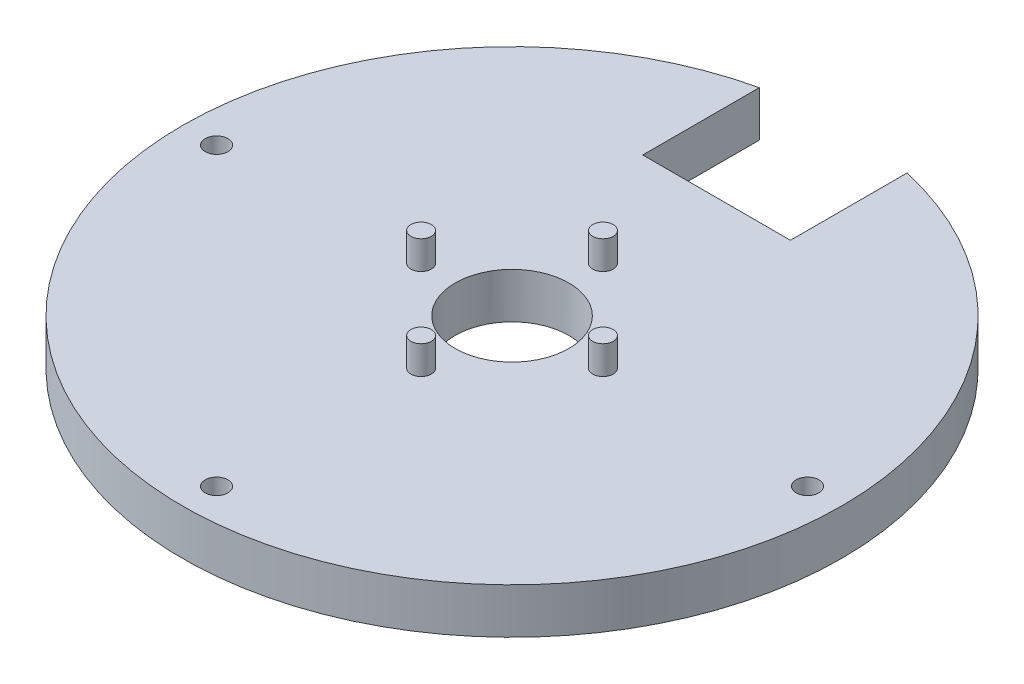
ISO-10303-21;
HEADER;
FILE_DESCRIPTION(('STEP AP214'),'2;1');
FILE_NAME('part.step','',(''),(''),'','','');
FILE_SCHEMA(('AUTOMOTIVE_DESIGN { 1 0 10303 214 1 1 1 1 }'));
ENDSEC;
DATA;
#1=APPLICATION_CONTEXT('core data for automotive mechanical design processes');
#2=APPLICATION_PROTOCOL_DEFINITION('international standard','automotive_design',2000,#1);
#3=PRODUCT_CONTEXT('',#1,'mechanical');
#4=PRODUCT('Part','Part','',(#3));
#5=PRODUCT_RELATED_PRODUCT_CATEGORY('part','',(#4));
#6=PRODUCT_DEFINITION_FORMATION('','',#4);
#7=PRODUCT_DEFINITION_CONTEXT('part definition',#1,'design');
#8=PRODUCT_DEFINITION('design','',#6,#7);
#9=PRODUCT_DEFINITION_SHAPE('','',#8);
#10=(LENGTH_UNIT() NAMED_UNIT(*) SI_UNIT(.MILLI.,.METRE.));
#11=(NAMED_UNIT(*) PLANE_ANGLE_UNIT() SI_UNIT($,.RADIAN.));
#12=(NAMED_UNIT(*) SI_UNIT($,.STERADIAN.) SOLID_ANGLE_UNIT());
#13=UNCERTAINTY_MEASURE_WITH_UNIT(LENGTH_MEASURE(1.E-05),#10,'distance_accuracy_value','');
#14=(GEOMETRIC_REPRESENTATION_CONTEXT(3) GLOBAL_UNCERTAINTY_ASSIGNED_CONTEXT((#13)) GLOBAL_UNIT_ASSIGNED_CONTEXT((#10,
#11,#12)) REPRESENTATION_CONTEXT('',''));
#15=CARTESIAN_POINT('',(0.,0.,0.));
#16=DIRECTION('',(0.,0.,1.));
#17=DIRECTION('',(1.,0.,0.));
#18=AXIS2_PLACEMENT_3D('',#15,#16,#17);
#19=CARTESIAN_POINT('',(0.,5.,0.));
#20=DIRECTION('',(0.,-1.,0.));
#21=DIRECTION('',(0.,0.,-1.));
#22=AXIS2_PLACEMENT_3D('',#19,#20,#21);
#23=CYLINDRICAL_SURFACE('',#22,29.);
#24=CARTESIAN_POINT('',(0.,1.,0.));
#25=DIRECTION('',(0.,-1.,0.));
#26=DIRECTION('',(0.,0.,-1.));
#27=AXIS2_PLACEMENT_3D('',#24,#25,#26);
#28=CIRCLE('',#27,29.);
#29=CARTESIAN_POINT('',(6.5,1.,-28.2621655221252));
#30=VERTEX_POINT('',#29);
#31=CARTESIAN_POINT('',(-6.5,1.,-28.2621655221252));
#32=VERTEX_POINT('',#31);
#33=EDGE_CURVE('E48',#30,#32,#28,.T.);
#34=ORIENTED_EDGE('',*,*,#33,.F.);
#35=DIRECTION('',(0.,-1.,0.));
#36=VECTOR('',#35,1.);
#37=CARTESIAN_POINT('',(6.5,5.,-28.2621655221252));
#38=LINE('',#37,#36);
#39=CARTESIAN_POINT('',(6.5,5.,-28.2621655221252));
#40=VERTEX_POINT('',#39);
#41=EDGE_CURVE('E41',#30,#40,#38,.F.);
#42=ORIENTED_EDGE('',*,*,#41,.T.);
#43=CARTESIAN_POINT('',(0.,5.,0.));
#44=DIRECTION('',(0.,1.,0.));
#45=DIRECTION('',(0.,0.,1.));
#46=AXIS2_PLACEMENT_3D('',#43,#44,#45);
#47=CIRCLE('',#46,29.);
#48=CARTESIAN_POINT('',(-6.5,5.,-28.2621655221252));
#49=VERTEX_POINT('',#48);
#50=EDGE_CURVE('E11',#49,#40,#47,.T.);
#51=ORIENTED_EDGE('',*,*,#50,.F.);
#52=DIRECTION('',(0.,-1.,0.));
#53=VECTOR('',#52,1.);
#54=CARTESIAN_POINT('',(-6.5,5.,-28.2621655221252));
#55=LINE('',#54,#53);
#56=EDGE_CURVE('E81',#49,#32,#55,.T.);
#57=ORIENTED_EDGE('',*,*,#56,.T.);
#58=EDGE_LOOP('',(#34,#42,#51,#57));
#59=FACE_BOUND('',#58,.T.);
#60=ADVANCED_FACE('F33',(#59),#23,.T.);
#61=CARTESIAN_POINT('',(6.5,-5.,-29.));
#62=DIRECTION('',(1.,0.,0.));
#63=DIRECTION('',(0.,0.,-1.));
#64=AXIS2_PLACEMENT_3D('',#61,#62,#63);
#65=PLANE('',#64);
#66=DIRECTION('',(0.,0.,-1.));
#67=VECTOR('',#66,1.);
#68=CARTESIAN_POINT('',(6.5,1.,-29.));
#69=LINE('',#68,#67);
#70=CARTESIAN_POINT('',(6.5,1.,-18.));
#71=VERTEX_POINT('',#70);
#72=EDGE_CURVE('E72',#71,#30,#69,.T.);
#73=ORIENTED_EDGE('',*,*,#72,.F.);
#74=DIRECTION('',(0.,1.,0.));
#75=VECTOR('',#74,1.);
#76=CARTESIAN_POINT('',(6.5,-5.,-18.));
#77=LINE('',#76,#75);
#78=CARTESIAN_POINT('',(6.5,5.,-18.));
#79=VERTEX_POINT('',#78);
#80=EDGE_CURVE('E87',#71,#79,#77,.T.);
#81=ORIENTED_EDGE('',*,*,#80,.T.);
#82=DIRECTION('',(0.,0.,-1.));
#83=VECTOR('',#82,1.);
#84=CARTESIAN_POINT('',(6.5,5.,-29.));
#85=LINE('',#84,#83);
#86=EDGE_CURVE('E85',#79,#40,#85,.T.);
#87=ORIENTED_EDGE('',*,*,#86,.T.);
#88=ORIENTED_EDGE('',*,*,#41,.F.);
#89=EDGE_LOOP('',(#73,#81,#87,#88));
#90=FACE_BOUND('',#89,.T.);
#91=ADVANCED_FACE('F83',(#90),#65,.F.);
#92=CARTESIAN_POINT('',(-6.5,-5.,-18.));
#93=DIRECTION('',(0.,0.,1.));
#94=DIRECTION('',(1.,0.,0.));
#95=AXIS2_PLACEMENT_3D('',#92,#93,#94);
#96=PLANE('',#95);
#97=DIRECTION('',(1.,0.,0.));
#98=VECTOR('',#97,1.);
#99=CARTESIAN_POINT('',(-6.5,1.,-18.));
#100=LINE('',#99,#98);
#101=CARTESIAN_POINT('',(-6.5,1.,-18.));
#102=VERTEX_POINT('',#101);
#103=EDGE_CURVE('E75',#102,#71,#100,.T.);
#104=ORIENTED_EDGE('',*,*,#103,.F.);
#105=DIRECTION('',(0.,1.,0.));
#106=VECTOR('',#105,1.);
#107=CARTESIAN_POINT('',(-6.5,-5.,-18.));
#108=LINE('',#107,#106);
#109=CARTESIAN_POINT('',(-6.5,5.,-18.));
#110=VERTEX_POINT('',#109);
#111=EDGE_CURVE('E90',#102,#110,#108,.T.);
#112=ORIENTED_EDGE('',*,*,#111,.T.);
#113=DIRECTION('',(1.,0.,0.));
#114=VECTOR('',#113,1.);
#115=CARTESIAN_POINT('',(-6.5,5.,-18.));
#116=LINE('',#115,#114);
#117=EDGE_CURVE('E92',#110,#79,#116,.T.);
#118=ORIENTED_EDGE('',*,*,#117,.T.);
#119=ORIENTED_EDGE('',*,*,#80,.F.);
#120=EDGE_LOOP('',(#104,#112,#118,#119));
#121=FACE_BOUND('',#120,.T.);
#122=ADVANCED_FACE('F172',(#121),#96,.F.);
#123=CARTESIAN_POINT('',(-6.5,-5.,-29.));
#124=DIRECTION('',(-1.,0.,0.));
#125=DIRECTION('',(0.,0.,1.));
#126=AXIS2_PLACEMENT_3D('',#123,#124,#125);
#127=PLANE('',#126);
#128=DIRECTION('',(0.,0.,1.));
#129=VECTOR('',#128,1.);
#130=CARTESIAN_POINT('',(-6.5,1.,-29.));
#131=LINE('',#130,#129);
#132=EDGE_CURVE('E136',#32,#102,#131,.T.);
#133=ORIENTED_EDGE('',*,*,#132,.F.);
#134=ORIENTED_EDGE('',*,*,#56,.F.);
#135=DIRECTION('',(0.,0.,1.));
#136=VECTOR('',#135,1.);
#137=CARTESIAN_POINT('',(-6.5,5.,-29.));
#138=LINE('',#137,#136);
#139=EDGE_CURVE('E96',#49,#110,#138,.T.);
#140=ORIENTED_EDGE('',*,*,#139,.T.);
#141=ORIENTED_EDGE('',*,*,#111,.F.);
#142=EDGE_LOOP('',(#133,#134,#140,#141));
#143=FACE_BOUND('',#142,.T.);
#144=ADVANCED_FACE('F177',(#143),#127,.F.);
#145=CARTESIAN_POINT('',(0.,0.,0.));
#146=DIRECTION('',(0.,1.,0.));
#147=DIRECTION('',(0.,0.,1.));
#148=AXIS2_PLACEMENT_3D('',#145,#146,#147);
#149=CYLINDRICAL_SURFACE('',#148,5.);
#150=CARTESIAN_POINT('',(0.,5.,0.));
#151=DIRECTION('',(0.,1.,0.));
#152=DIRECTION('',(0.,0.,1.));
#153=AXIS2_PLACEMENT_3D('',#150,#151,#152);
#154=CIRCLE('',#153,5.);
#155=CARTESIAN_POINT('',(0.,5.,5.));
#156=VERTEX_POINT('',#155);
#157=EDGE_CURVE('E122',#156,#156,#154,.T.);
#158=ORIENTED_EDGE('',*,*,#157,.T.);
#159=EDGE_LOOP('',(#158));
#160=FACE_BOUND('',#159,.T.);
#161=CARTESIAN_POINT('',(0.,1.,0.));
#162=DIRECTION('',(0.,-1.,0.));
#163=DIRECTION('',(0.,0.,-1.));
#164=AXIS2_PLACEMENT_3D('',#161,#162,#163);
#165=CIRCLE('',#164,5.);
#166=CARTESIAN_POINT('',(0.,1.,-5.));
#167=VERTEX_POINT('',#166);
#168=EDGE_CURVE('E138',#167,#167,#165,.F.);
#169=ORIENTED_EDGE('',*,*,#168,.F.);
#170=EDGE_LOOP('',(#169));
#171=FACE_BOUND('',#170,.T.);
#172=ADVANCED_FACE('F182',(#160,#171),#149,.F.);
#173=CARTESIAN_POINT('',(26.,0.,0.));
#174=DIRECTION('',(0.,1.,0.));
#175=DIRECTION('',(0.,0.,1.));
#176=AXIS2_PLACEMENT_3D('',#173,#174,#175);
#177=CYLINDRICAL_SURFACE('',#176,1.);
#178=CARTESIAN_POINT('',(26.,5.,0.));
#179=DIRECTION('',(0.,1.,0.));
#180=DIRECTION('',(0.,0.,1.));
#181=AXIS2_PLACEMENT_3D('',#178,#179,#180);
#182=CIRCLE('',#181,1.);
#183=CARTESIAN_POINT('',(26.,5.,1.));
#184=VERTEX_POINT('',#183);
#185=EDGE_CURVE('E78',#184,#184,#182,.T.);
#186=ORIENTED_EDGE('',*,*,#185,.T.);
#187=EDGE_LOOP('',(#186));
#188=FACE_BOUND('',#187,.T.);
#189=CARTESIAN_POINT('',(26.,1.,0.));
#190=DIRECTION('',(0.,-1.,0.));
#191=DIRECTION('',(0.,0.,-1.));
#192=AXIS2_PLACEMENT_3D('',#189,#190,#191);
#193=CIRCLE('',#192,1.);
#194=CARTESIAN_POINT('',(26.,1.,-1.));
#195=VERTEX_POINT('',#194);
#196=EDGE_CURVE('E141',#195,#195,#193,.F.);
#197=ORIENTED_EDGE('',*,*,#196,.F.);
#198=EDGE_LOOP('',(#197));
#199=FACE_BOUND('',#198,.T.);
#200=ADVANCED_FACE('F164',(#188,#199),#177,.F.);
#201=CARTESIAN_POINT('',(0.,0.,26.));
#202=DIRECTION('',(0.,1.,0.));
#203=DIRECTION('',(0.,0.,1.));
#204=AXIS2_PLACEMENT_3D('',#201,#202,#203);
#205=CYLINDRICAL_SURFACE('',#204,1.);
#206=CARTESIAN_POINT('',(0.,5.,26.));
#207=DIRECTION('',(0.,1.,0.));
#208=DIRECTION('',(0.,0.,1.));
#209=AXIS2_PLACEMENT_3D('',#206,#207,#208);
#210=CIRCLE('',#209,1.);
#211=CARTESIAN_POINT('',(0.,5.,27.));
#212=VERTEX_POINT('',#211);
#213=EDGE_CURVE('E130',#212,#212,#210,.T.);
#214=ORIENTED_EDGE('',*,*,#213,.T.);
#215=EDGE_LOOP('',(#214));
#216=FACE_BOUND('',#215,.T.);
#217=CARTESIAN_POINT('',(0.,1.,26.));
#218=DIRECTION('',(0.,-1.,0.));
#219=DIRECTION('',(0.,0.,-1.));
#220=AXIS2_PLACEMENT_3D('',#217,#218,#219);
#221=CIRCLE('',#220,1.);
#222=CARTESIAN_POINT('',(0.,1.,25.));
#223=VERTEX_POINT('',#222);
#224=EDGE_CURVE('E144',#223,#223,#221,.F.);
#225=ORIENTED_EDGE('',*,*,#224,.F.);
#226=EDGE_LOOP('',(#225));
#227=FACE_BOUND('',#226,.T.);
#228=ADVANCED_FACE('F155',(#216,#227),#205,.F.);
#229=CARTESIAN_POINT('',(-26.,0.,0.));
#230=DIRECTION('',(0.,1.,0.));
#231=DIRECTION('',(0.,0.,1.));
#232=AXIS2_PLACEMENT_3D('',#229,#230,#231);
#233=CYLINDRICAL_SURFACE('',#232,1.);
#234=CARTESIAN_POINT('',(-26.,5.,0.));
#235=DIRECTION('',(0.,1.,0.));
#236=DIRECTION('',(0.,0.,1.));
#237=AXIS2_PLACEMENT_3D('',#234,#235,#236);
#238=CIRCLE('',#237,1.);
#239=CARTESIAN_POINT('',(-26.,5.,1.));
#240=VERTEX_POINT('',#239);
#241=EDGE_CURVE('E127',#240,#240,#238,.T.);
#242=ORIENTED_EDGE('',*,*,#241,.T.);
#243=EDGE_LOOP('',(#242));
#244=FACE_BOUND('',#243,.T.);
#245=CARTESIAN_POINT('',(-26.,1.,0.));
#246=DIRECTION('',(0.,-1.,0.));
#247=DIRECTION('',(0.,0.,-1.));
#248=AXIS2_PLACEMENT_3D('',#245,#246,#247);
#249=CIRCLE('',#248,1.);
#250=CARTESIAN_POINT('',(-26.,1.,-0.999999999999998));
#251=VERTEX_POINT('',#250);
#252=EDGE_CURVE('E36',#251,#251,#249,.F.);
#253=ORIENTED_EDGE('',*,*,#252,.F.);
#254=EDGE_LOOP('',(#253));
#255=FACE_BOUND('',#254,.T.);
#256=ADVANCED_FACE('F152',(#244,#255),#233,.F.);
#257=CARTESIAN_POINT('',(0.,5.,0.));
#258=DIRECTION('',(0.,1.,0.));
#259=DIRECTION('',(0.,0.,1.));
#260=AXIS2_PLACEMENT_3D('',#257,#258,#259);
#261=PLANE('',#260);
#262=ORIENTED_EDGE('',*,*,#241,.F.);
#263=EDGE_LOOP('',(#262));
#264=FACE_BOUND('',#263,.T.);
#265=ORIENTED_EDGE('',*,*,#213,.F.);
#266=EDGE_LOOP('',(#265));
#267=FACE_BOUND('',#266,.T.);
#268=ORIENTED_EDGE('',*,*,#185,.F.);
#269=EDGE_LOOP('',(#268));
#270=FACE_BOUND('',#269,.T.);
#271=ORIENTED_EDGE('',*,*,#157,.F.);
#272=EDGE_LOOP('',(#271));
#273=FACE_BOUND('',#272,.T.);
#274=CARTESIAN_POINT('',(0.,5.,8.));
#275=DIRECTION('',(0.,1.,0.));
#276=DIRECTION('',(0.,0.,1.));
#277=AXIS2_PLACEMENT_3D('',#274,#275,#276);
#278=CIRCLE('',#277,0.9);
#279=CARTESIAN_POINT('',(0.,5.,8.9));
#280=VERTEX_POINT('',#279);
#281=EDGE_CURVE('E119',#280,#280,#278,.T.);
#282=ORIENTED_EDGE('',*,*,#281,.F.);
#283=EDGE_LOOP('',(#282));
#284=FACE_BOUND('',#283,.T.);
#285=CARTESIAN_POINT('',(0.,5.,-8.));
#286=DIRECTION('',(0.,1.,0.));
#287=DIRECTION('',(0.,0.,1.));
#288=AXIS2_PLACEMENT_3D('',#285,#286,#287);
#289=CIRCLE('',#288,0.9);
#290=CARTESIAN_POINT('',(0.,5.,-7.1));
#291=VERTEX_POINT('',#290);
#292=EDGE_CURVE('E113',#291,#291,#289,.T.);
#293=ORIENTED_EDGE('',*,*,#292,.F.);
#294=EDGE_LOOP('',(#293));
#295=FACE_BOUND('',#294,.T.);
#296=CARTESIAN_POINT('',(-8.,5.,0.));
#297=DIRECTION('',(0.,1.,0.));
#298=DIRECTION('',(0.,0.,1.));
#299=AXIS2_PLACEMENT_3D('',#296,#297,#298);
#300=CIRCLE('',#299,0.899999999999999);
#301=CARTESIAN_POINT('',(-8.,5.,0.9));
#302=VERTEX_POINT('',#301);
#303=EDGE_CURVE('E107',#302,#302,#300,.T.);
#304=ORIENTED_EDGE('',*,*,#303,.F.);
#305=EDGE_LOOP('',(#304));
#306=FACE_BOUND('',#305,.T.);
#307=CARTESIAN_POINT('',(8.,5.,0.));
#308=DIRECTION('',(0.,1.,0.));
#309=DIRECTION('',(0.,0.,1.));
#310=AXIS2_PLACEMENT_3D('',#307,#308,#309);
#311=CIRCLE('',#310,0.9);
#312=CARTESIAN_POINT('',(8.,5.,0.9));
#313=VERTEX_POINT('',#312);
#314=EDGE_CURVE('E101',#313,#313,#311,.T.);
#315=ORIENTED_EDGE('',*,*,#314,.F.);
#316=EDGE_LOOP('',(#315));
#317=FACE_BOUND('',#316,.T.);
#318=ORIENTED_EDGE('',*,*,#86,.F.);
#319=ORIENTED_EDGE('',*,*,#117,.F.);
#320=ORIENTED_EDGE('',*,*,#139,.F.);
#321=ORIENTED_EDGE('',*,*,#50,.T.);
#322=EDGE_LOOP('',(#318,#319,#320,#321));
#323=FACE_BOUND('',#322,.T.);
#324=ADVANCED_FACE('F154',(#264,#267,#270,#273,#284,#295,#306,#317,#323),#261,.T.);
#325=CARTESIAN_POINT('',(8.,7.5,0.));
#326=DIRECTION('',(0.,-1.,0.));
#327=DIRECTION('',(0.,0.,-1.));
#328=AXIS2_PLACEMENT_3D('',#325,#326,#327);
#329=CYLINDRICAL_SURFACE('',#328,0.9);
#330=CARTESIAN_POINT('',(8.,7.5,0.));
#331=DIRECTION('',(0.,1.,0.));
#332=DIRECTION('',(0.,0.,1.));
#333=AXIS2_PLACEMENT_3D('',#330,#331,#332);
#334=CIRCLE('',#333,0.9);
#335=CARTESIAN_POINT('',(8.,7.5,0.9));
#336=VERTEX_POINT('',#335);
#337=EDGE_CURVE('E100',#336,#336,#334,.T.);
#338=ORIENTED_EDGE('',*,*,#337,.F.);
#339=EDGE_LOOP('',(#338));
#340=FACE_BOUND('',#339,.T.);
#341=ORIENTED_EDGE('',*,*,#314,.T.);
#342=EDGE_LOOP('',(#341));
#343=FACE_BOUND('',#342,.T.);
#344=ADVANCED_FACE('F162',(#340,#343),#329,.T.);
#345=CARTESIAN_POINT('',(8.,7.5,0.));
#346=DIRECTION('',(0.,1.,0.));
#347=DIRECTION('',(0.,0.,1.));
#348=AXIS2_PLACEMENT_3D('',#345,#346,#347);
#349=PLANE('',#348);
#350=ORIENTED_EDGE('',*,*,#337,.T.);
#351=EDGE_LOOP('',(#350));
#352=FACE_BOUND('',#351,.T.);
#353=ADVANCED_FACE('F187',(#352),#349,.T.);
#354=CARTESIAN_POINT('',(-8.,7.5,0.));
#355=DIRECTION('',(0.,-1.,0.));
#356=DIRECTION('',(0.,0.,-1.));
#357=AXIS2_PLACEMENT_3D('',#354,#355,#356);
#358=CYLINDRICAL_SURFACE('',#357,0.899999999999999);
#359=CARTESIAN_POINT('',(-8.,7.5,0.));
#360=DIRECTION('',(0.,1.,0.));
#361=DIRECTION('',(0.,0.,1.));
#362=AXIS2_PLACEMENT_3D('',#359,#360,#361);
#363=CIRCLE('',#362,0.899999999999999);
#364=CARTESIAN_POINT('',(-8.,7.5,0.9));
#365=VERTEX_POINT('',#364);
#366=EDGE_CURVE('E104',#365,#365,#363,.T.);
#367=ORIENTED_EDGE('',*,*,#366,.F.);
#368=EDGE_LOOP('',(#367));
#369=FACE_BOUND('',#368,.T.);
#370=ORIENTED_EDGE('',*,*,#303,.T.);
#371=EDGE_LOOP('',(#370));
#372=FACE_BOUND('',#371,.T.);
#373=ADVANCED_FACE('F191',(#369,#372),#358,.T.);
#374=CARTESIAN_POINT('',(-8.,7.5,0.));
#375=DIRECTION('',(0.,1.,0.));
#376=DIRECTION('',(0.,0.,1.));
#377=AXIS2_PLACEMENT_3D('',#374,#375,#376);
#378=PLANE('',#377);
#379=ORIENTED_EDGE('',*,*,#366,.T.);
#380=EDGE_LOOP('',(#379));
#381=FACE_BOUND('',#380,.T.);
#382=ADVANCED_FACE('F195',(#381),#378,.T.);
#383=CARTESIAN_POINT('',(0.,7.5,-8.));
#384=DIRECTION('',(0.,-1.,0.));
#385=DIRECTION('',(0.,0.,-1.));
#386=AXIS2_PLACEMENT_3D('',#383,#384,#385);
#387=CYLINDRICAL_SURFACE('',#386,0.9);
#388=CARTESIAN_POINT('',(0.,7.5,-8.));
#389=DIRECTION('',(0.,1.,0.));
#390=DIRECTION('',(0.,0.,1.));
#391=AXIS2_PLACEMENT_3D('',#388,#389,#390);
#392=CIRCLE('',#391,0.9);
#393=CARTESIAN_POINT('',(0.,7.5,-7.1));
#394=VERTEX_POINT('',#393);
#395=EDGE_CURVE('E110',#394,#394,#392,.T.);
#396=ORIENTED_EDGE('',*,*,#395,.F.);
#397=EDGE_LOOP('',(#396));
#398=FACE_BOUND('',#397,.T.);
#399=ORIENTED_EDGE('',*,*,#292,.T.);
#400=EDGE_LOOP('',(#399));
#401=FACE_BOUND('',#400,.T.);
#402=ADVANCED_FACE('F199',(#398,#401),#387,.T.);
#403=CARTESIAN_POINT('',(0.,7.5,-8.));
#404=DIRECTION('',(0.,1.,0.));
#405=DIRECTION('',(0.,0.,1.));
#406=AXIS2_PLACEMENT_3D('',#403,#404,#405);
#407=PLANE('',#406);
#408=ORIENTED_EDGE('',*,*,#395,.T.);
#409=EDGE_LOOP('',(#408));
#410=FACE_BOUND('',#409,.T.);
#411=ADVANCED_FACE('F203',(#410),#407,.T.);
#412=CARTESIAN_POINT('',(0.,7.5,8.));
#413=DIRECTION('',(0.,-1.,0.));
#414=DIRECTION('',(0.,0.,-1.));
#415=AXIS2_PLACEMENT_3D('',#412,#413,#414);
#416=CYLINDRICAL_SURFACE('',#415,0.9);
#417=CARTESIAN_POINT('',(0.,7.5,8.));
#418=DIRECTION('',(0.,1.,0.));
#419=DIRECTION('',(0.,0.,1.));
#420=AXIS2_PLACEMENT_3D('',#417,#418,#419);
#421=CIRCLE('',#420,0.9);
#422=CARTESIAN_POINT('',(0.,7.5,8.9));
#423=VERTEX_POINT('',#422);
#424=EDGE_CURVE('E116',#423,#423,#421,.T.);
#425=ORIENTED_EDGE('',*,*,#424,.F.);
#426=EDGE_LOOP('',(#425));
#427=FACE_BOUND('',#426,.T.);
#428=ORIENTED_EDGE('',*,*,#281,.T.);
#429=EDGE_LOOP('',(#428));
#430=FACE_BOUND('',#429,.T.);
#431=ADVANCED_FACE('F207',(#427,#430),#416,.T.);
#432=CARTESIAN_POINT('',(0.,7.5,8.));
#433=DIRECTION('',(0.,1.,0.));
#434=DIRECTION('',(0.,0.,1.));
#435=AXIS2_PLACEMENT_3D('',#432,#433,#434);
#436=PLANE('',#435);
#437=ORIENTED_EDGE('',*,*,#424,.T.);
#438=EDGE_LOOP('',(#437));
#439=FACE_BOUND('',#438,.T.);
#440=ADVANCED_FACE('F211',(#439),#436,.T.);
#441=CARTESIAN_POINT('',(0.,1.,0.));
#442=DIRECTION('',(0.,-1.,0.));
#443=DIRECTION('',(0.,0.,-1.));
#444=AXIS2_PLACEMENT_3D('',#441,#442,#443);
#445=PLANE('',#444);
#446=ORIENTED_EDGE('',*,*,#168,.T.);
#447=EDGE_LOOP('',(#446));
#448=FACE_BOUND('',#447,.T.);
#449=ORIENTED_EDGE('',*,*,#196,.T.);
#450=EDGE_LOOP('',(#449));
#451=FACE_BOUND('',#450,.T.);
#452=ORIENTED_EDGE('',*,*,#224,.T.);
#453=EDGE_LOOP('',(#452));
#454=FACE_BOUND('',#453,.T.);
#455=ORIENTED_EDGE('',*,*,#252,.T.);
#456=EDGE_LOOP('',(#455));
#457=FACE_BOUND('',#456,.T.);
#458=ORIENTED_EDGE('',*,*,#72,.T.);
#459=ORIENTED_EDGE('',*,*,#33,.T.);
#460=ORIENTED_EDGE('',*,*,#132,.T.);
#461=ORIENTED_EDGE('',*,*,#103,.T.);
#462=EDGE_LOOP('',(#458,#459,#460,#461));
#463=FACE_BOUND('',#462,.T.);
#464=ADVANCED_FACE('F73',(#448,#451,#454,#457,#463),#445,.T.);
#465=CLOSED_SHELL('',(#60,#91,#122,#144,#172,#200,#228,#256,#324,#344,#353,#373,#382,#402,#411,
#431,#440,#464));
#466=MANIFOLD_SOLID_BREP('B2',#465);
#467=ADVANCED_BREP_SHAPE_REPRESENTATION('',(#18,#466),#14);
#468=SHAPE_DEFINITION_REPRESENTATION(#9,#467);
ENDSEC;
END-ISO-10303-21;
